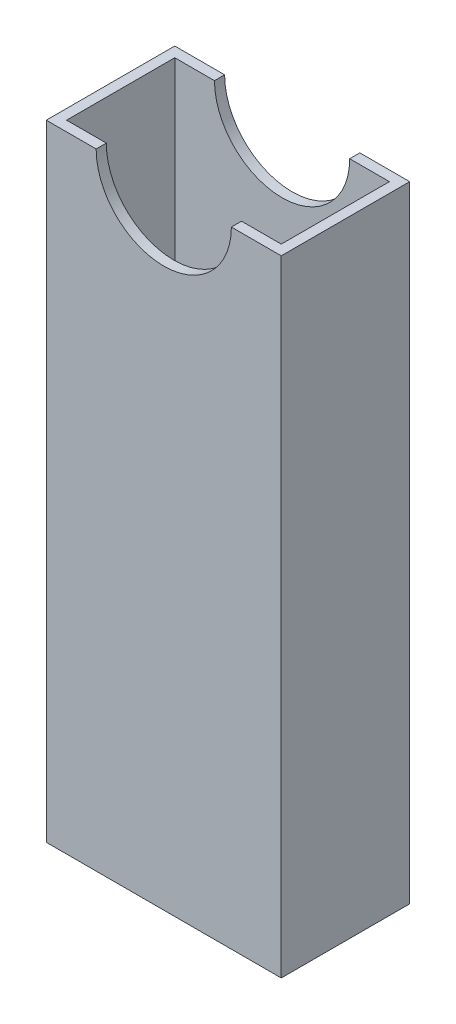
ISO-10303-21;
HEADER;
FILE_DESCRIPTION(('STEP AP214'),'2;1');
FILE_NAME('part.step','',(''),(''),'','','');
FILE_SCHEMA(('AUTOMOTIVE_DESIGN { 1 0 10303 214 1 1 1 1 }'));
ENDSEC;
DATA;
#1=APPLICATION_CONTEXT('core data for automotive mechanical design processes');
#2=APPLICATION_PROTOCOL_DEFINITION('international standard','automotive_design',2000,#1);
#3=PRODUCT_CONTEXT('',#1,'mechanical');
#4=PRODUCT('Part','Part','',(#3));
#5=PRODUCT_RELATED_PRODUCT_CATEGORY('part','',(#4));
#6=PRODUCT_DEFINITION_FORMATION('','',#4);
#7=PRODUCT_DEFINITION_CONTEXT('part definition',#1,'design');
#8=PRODUCT_DEFINITION('design','',#6,#7);
#9=PRODUCT_DEFINITION_SHAPE('','',#8);
#10=(LENGTH_UNIT() NAMED_UNIT(*) SI_UNIT(.MILLI.,.METRE.));
#11=(NAMED_UNIT(*) PLANE_ANGLE_UNIT() SI_UNIT($,.RADIAN.));
#12=(NAMED_UNIT(*) SI_UNIT($,.STERADIAN.) SOLID_ANGLE_UNIT());
#13=UNCERTAINTY_MEASURE_WITH_UNIT(LENGTH_MEASURE(1.E-05),#10,'distance_accuracy_value','');
#14=(GEOMETRIC_REPRESENTATION_CONTEXT(3) GLOBAL_UNCERTAINTY_ASSIGNED_CONTEXT((#13)) GLOBAL_UNIT_ASSIGNED_CONTEXT((#10,
#11,#12)) REPRESENTATION_CONTEXT('',''));
#15=CARTESIAN_POINT('',(0.,0.,0.));
#16=DIRECTION('',(0.,0.,1.));
#17=DIRECTION('',(1.,0.,0.));
#18=AXIS2_PLACEMENT_3D('',#15,#16,#17);
#19=CARTESIAN_POINT('',(0.,92.5,0.));
#20=DIRECTION('',(0.,1.,0.));
#21=DIRECTION('',(0.,0.,1.));
#22=AXIS2_PLACEMENT_3D('',#19,#20,#21);
#23=PLANE('',#22);
#24=DIRECTION('',(0.,0.,1.));
#25=VECTOR('',#24,1.);
#26=CARTESIAN_POINT('',(-10.,92.5,-31.8606797749979));
#27=LINE('',#26,#25);
#28=CARTESIAN_POINT('',(-10.,92.5,-9.5));
#29=VERTEX_POINT('',#28);
#30=CARTESIAN_POINT('',(-10.,92.5,-8.));
#31=VERTEX_POINT('',#30);
#32=EDGE_CURVE('E57',#29,#31,#27,.T.);
#33=ORIENTED_EDGE('',*,*,#32,.F.);
#34=DIRECTION('',(-1.,0.,0.));
#35=VECTOR('',#34,1.);
#36=CARTESIAN_POINT('',(17.375,92.5,-9.5));
#37=LINE('',#36,#35);
#38=CARTESIAN_POINT('',(-17.375,92.5,-9.5));
#39=VERTEX_POINT('',#38);
#40=EDGE_CURVE('E137',#29,#39,#37,.T.);
#41=ORIENTED_EDGE('',*,*,#40,.T.);
#42=DIRECTION('',(0.,0.,1.));
#43=VECTOR('',#42,1.);
#44=CARTESIAN_POINT('',(-17.375,92.5,-9.5));
#45=LINE('',#44,#43);
#46=CARTESIAN_POINT('',(-17.375,92.5,9.5));
#47=VERTEX_POINT('',#46);
#48=EDGE_CURVE('E187',#39,#47,#45,.T.);
#49=ORIENTED_EDGE('',*,*,#48,.T.);
#50=DIRECTION('',(1.,0.,0.));
#51=VECTOR('',#50,1.);
#52=CARTESIAN_POINT('',(-17.375,92.5,9.5));
#53=LINE('',#52,#51);
#54=CARTESIAN_POINT('',(-10.,92.5,9.5));
#55=VERTEX_POINT('',#54);
#56=EDGE_CURVE('E182',#47,#55,#53,.T.);
#57=ORIENTED_EDGE('',*,*,#56,.T.);
#58=CARTESIAN_POINT('',(-10.,92.5,8.));
#59=VERTEX_POINT('',#58);
#60=EDGE_CURVE('E129',#59,#55,#27,.T.);
#61=ORIENTED_EDGE('',*,*,#60,.F.);
#62=DIRECTION('',(1.,0.,0.));
#63=VECTOR('',#62,1.);
#64=CARTESIAN_POINT('',(-15.875,92.5,8.));
#65=LINE('',#64,#63);
#66=CARTESIAN_POINT('',(-15.875,92.5,8.));
#67=VERTEX_POINT('',#66);
#68=EDGE_CURVE('E218',#67,#59,#65,.T.);
#69=ORIENTED_EDGE('',*,*,#68,.F.);
#70=DIRECTION('',(0.,0.,1.));
#71=VECTOR('',#70,1.);
#72=CARTESIAN_POINT('',(-15.875,92.5,-8.));
#73=LINE('',#72,#71);
#74=CARTESIAN_POINT('',(-15.875,92.5,-8.));
#75=VERTEX_POINT('',#74);
#76=EDGE_CURVE('E205',#75,#67,#73,.T.);
#77=ORIENTED_EDGE('',*,*,#76,.F.);
#78=DIRECTION('',(-1.,0.,0.));
#79=VECTOR('',#78,1.);
#80=CARTESIAN_POINT('',(15.875,92.5,-8.));
#81=LINE('',#80,#79);
#82=EDGE_CURVE('E214',#31,#75,#81,.T.);
#83=ORIENTED_EDGE('',*,*,#82,.F.);
#84=EDGE_LOOP('',(#33,#41,#49,#57,#61,#69,#77,#83));
#85=FACE_BOUND('',#84,.T.);
#86=ADVANCED_FACE('F35',(#85),#23,.T.);
#87=CARTESIAN_POINT('',(17.375,1.5,0.));
#88=DIRECTION('',(1.,0.,0.));
#89=DIRECTION('',(0.,0.,-1.));
#90=AXIS2_PLACEMENT_3D('',#87,#88,#89);
#91=PLANE('',#90);
#92=DIRECTION('',(0.,0.,1.));
#93=VECTOR('',#92,1.);
#94=CARTESIAN_POINT('',(17.375,0.,0.));
#95=LINE('',#94,#93);
#96=CARTESIAN_POINT('',(17.375,0.,-9.5));
#97=VERTEX_POINT('',#96);
#98=CARTESIAN_POINT('',(17.375,0.,9.5));
#99=VERTEX_POINT('',#98);
#100=EDGE_CURVE('E144',#97,#99,#95,.T.);
#101=ORIENTED_EDGE('',*,*,#100,.F.);
#102=DIRECTION('',(0.,-1.,0.));
#103=VECTOR('',#102,1.);
#104=CARTESIAN_POINT('',(17.375,1.5,-9.5));
#105=LINE('',#104,#103);
#106=CARTESIAN_POINT('',(17.375,92.5,-9.5));
#107=VERTEX_POINT('',#106);
#108=EDGE_CURVE('E43',#107,#97,#105,.T.);
#109=ORIENTED_EDGE('',*,*,#108,.F.);
#110=DIRECTION('',(0.,0.,-1.));
#111=VECTOR('',#110,1.);
#112=CARTESIAN_POINT('',(17.375,92.5,9.5));
#113=LINE('',#112,#111);
#114=CARTESIAN_POINT('',(17.375,92.5,9.5));
#115=VERTEX_POINT('',#114);
#116=EDGE_CURVE('E143',#115,#107,#113,.T.);
#117=ORIENTED_EDGE('',*,*,#116,.F.);
#118=DIRECTION('',(0.,-1.,0.));
#119=VECTOR('',#118,1.);
#120=CARTESIAN_POINT('',(17.375,1.5,9.5));
#121=LINE('',#120,#119);
#122=EDGE_CURVE('E159',#115,#99,#121,.T.);
#123=ORIENTED_EDGE('',*,*,#122,.T.);
#124=EDGE_LOOP('',(#101,#109,#117,#123));
#125=FACE_BOUND('',#124,.T.);
#126=ADVANCED_FACE('F37',(#125),#91,.T.);
#127=CARTESIAN_POINT('',(0.,1.5,-9.5));
#128=DIRECTION('',(0.,0.,-1.));
#129=DIRECTION('',(-1.,0.,0.));
#130=AXIS2_PLACEMENT_3D('',#127,#128,#129);
#131=PLANE('',#130);
#132=CARTESIAN_POINT('',(0.,92.5,-9.5));
#133=DIRECTION('',(0.,0.,-1.));
#134=DIRECTION('',(-1.,0.,0.));
#135=AXIS2_PLACEMENT_3D('',#132,#133,#134);
#136=CIRCLE('',#135,10.);
#137=CARTESIAN_POINT('',(10.,92.5,-9.5));
#138=VERTEX_POINT('',#137);
#139=EDGE_CURVE('E124',#29,#138,#136,.F.);
#140=ORIENTED_EDGE('',*,*,#139,.T.);
#141=EDGE_CURVE('E135',#107,#138,#37,.T.);
#142=ORIENTED_EDGE('',*,*,#141,.F.);
#143=ORIENTED_EDGE('',*,*,#108,.T.);
#144=DIRECTION('',(1.,0.,0.));
#145=VECTOR('',#144,1.);
#146=CARTESIAN_POINT('',(0.,0.,-9.5));
#147=LINE('',#146,#145);
#148=CARTESIAN_POINT('',(-17.375,0.,-9.5));
#149=VERTEX_POINT('',#148);
#150=EDGE_CURVE('E147',#149,#97,#147,.T.);
#151=ORIENTED_EDGE('',*,*,#150,.F.);
#152=DIRECTION('',(0.,-1.,0.));
#153=VECTOR('',#152,1.);
#154=CARTESIAN_POINT('',(-17.375,1.5,-9.5));
#155=LINE('',#154,#153);
#156=EDGE_CURVE('E164',#39,#149,#155,.T.);
#157=ORIENTED_EDGE('',*,*,#156,.F.);
#158=ORIENTED_EDGE('',*,*,#40,.F.);
#159=EDGE_LOOP('',(#140,#142,#143,#151,#157,#158));
#160=FACE_BOUND('',#159,.T.);
#161=ADVANCED_FACE('F134',(#160),#131,.T.);
#162=CARTESIAN_POINT('',(-17.375,1.5,0.));
#163=DIRECTION('',(1.,0.,0.));
#164=DIRECTION('',(0.,0.,-1.));
#165=AXIS2_PLACEMENT_3D('',#162,#163,#164);
#166=PLANE('',#165);
#167=DIRECTION('',(0.,0.,1.));
#168=VECTOR('',#167,1.);
#169=CARTESIAN_POINT('',(-17.375,0.,0.));
#170=LINE('',#169,#168);
#171=CARTESIAN_POINT('',(-17.375,0.,9.5));
#172=VERTEX_POINT('',#171);
#173=EDGE_CURVE('E154',#149,#172,#170,.T.);
#174=ORIENTED_EDGE('',*,*,#173,.T.);
#175=DIRECTION('',(0.,-1.,0.));
#176=VECTOR('',#175,1.);
#177=CARTESIAN_POINT('',(-17.375,1.5,9.5));
#178=LINE('',#177,#176);
#179=EDGE_CURVE('E161',#47,#172,#178,.T.);
#180=ORIENTED_EDGE('',*,*,#179,.F.);
#181=ORIENTED_EDGE('',*,*,#48,.F.);
#182=ORIENTED_EDGE('',*,*,#156,.T.);
#183=EDGE_LOOP('',(#174,#180,#181,#182));
#184=FACE_BOUND('',#183,.T.);
#185=ADVANCED_FACE('F174',(#184),#166,.F.);
#186=CARTESIAN_POINT('',(0.,1.5,9.5));
#187=DIRECTION('',(0.,0.,-1.));
#188=DIRECTION('',(-1.,0.,0.));
#189=AXIS2_PLACEMENT_3D('',#186,#187,#188);
#190=PLANE('',#189);
#191=CARTESIAN_POINT('',(10.,92.5,9.5));
#192=VERTEX_POINT('',#191);
#193=EDGE_CURVE('E186',#192,#115,#53,.T.);
#194=ORIENTED_EDGE('',*,*,#193,.F.);
#195=CARTESIAN_POINT('',(0.,92.5,9.5));
#196=DIRECTION('',(0.,0.,1.));
#197=DIRECTION('',(1.,0.,0.));
#198=AXIS2_PLACEMENT_3D('',#195,#196,#197);
#199=CIRCLE('',#198,10.);
#200=EDGE_CURVE('E138',#55,#192,#199,.T.);
#201=ORIENTED_EDGE('',*,*,#200,.F.);
#202=ORIENTED_EDGE('',*,*,#56,.F.);
#203=ORIENTED_EDGE('',*,*,#179,.T.);
#204=DIRECTION('',(1.,0.,0.));
#205=VECTOR('',#204,1.);
#206=CARTESIAN_POINT('',(0.,0.,9.5));
#207=LINE('',#206,#205);
#208=EDGE_CURVE('E156',#172,#99,#207,.T.);
#209=ORIENTED_EDGE('',*,*,#208,.T.);
#210=ORIENTED_EDGE('',*,*,#122,.F.);
#211=EDGE_LOOP('',(#194,#201,#202,#203,#209,#210));
#212=FACE_BOUND('',#211,.T.);
#213=ADVANCED_FACE('F179',(#212),#190,.F.);
#214=CARTESIAN_POINT('',(0.,0.,0.));
#215=DIRECTION('',(0.,1.,0.));
#216=DIRECTION('',(0.,0.,1.));
#217=AXIS2_PLACEMENT_3D('',#214,#215,#216);
#218=PLANE('',#217);
#219=ORIENTED_EDGE('',*,*,#100,.T.);
#220=ORIENTED_EDGE('',*,*,#208,.F.);
#221=ORIENTED_EDGE('',*,*,#173,.F.);
#222=ORIENTED_EDGE('',*,*,#150,.T.);
#223=EDGE_LOOP('',(#219,#220,#221,#222));
#224=FACE_BOUND('',#223,.T.);
#225=ADVANCED_FACE('F172',(#224),#218,.F.);
#226=DIRECTION('',(0.,0.,1.));
#227=VECTOR('',#226,1.);
#228=CARTESIAN_POINT('',(10.,92.5,-31.8606797749979));
#229=LINE('',#228,#227);
#230=CARTESIAN_POINT('',(10.,92.5,8.));
#231=VERTEX_POINT('',#230);
#232=EDGE_CURVE('E50',#231,#192,#229,.T.);
#233=ORIENTED_EDGE('',*,*,#232,.T.);
#234=ORIENTED_EDGE('',*,*,#193,.T.);
#235=ORIENTED_EDGE('',*,*,#116,.T.);
#236=ORIENTED_EDGE('',*,*,#141,.T.);
#237=CARTESIAN_POINT('',(10.,92.5,-8.));
#238=VERTEX_POINT('',#237);
#239=EDGE_CURVE('E121',#138,#238,#229,.T.);
#240=ORIENTED_EDGE('',*,*,#239,.T.);
#241=CARTESIAN_POINT('',(15.875,92.5,-8.));
#242=VERTEX_POINT('',#241);
#243=EDGE_CURVE('E202',#242,#238,#81,.T.);
#244=ORIENTED_EDGE('',*,*,#243,.F.);
#245=DIRECTION('',(0.,0.,-1.));
#246=VECTOR('',#245,1.);
#247=CARTESIAN_POINT('',(15.875,92.5,8.));
#248=LINE('',#247,#246);
#249=CARTESIAN_POINT('',(15.875,92.5,8.));
#250=VERTEX_POINT('',#249);
#251=EDGE_CURVE('E215',#250,#242,#248,.T.);
#252=ORIENTED_EDGE('',*,*,#251,.F.);
#253=EDGE_CURVE('E221',#231,#250,#65,.T.);
#254=ORIENTED_EDGE('',*,*,#253,.F.);
#255=EDGE_LOOP('',(#233,#234,#235,#236,#240,#244,#252,#254));
#256=FACE_BOUND('',#255,.T.);
#257=ADVANCED_FACE('F141',(#256),#23,.T.);
#258=CARTESIAN_POINT('',(-15.875,92.5,-8.));
#259=DIRECTION('',(1.,0.,0.));
#260=DIRECTION('',(0.,0.,-1.));
#261=AXIS2_PLACEMENT_3D('',#258,#259,#260);
#262=PLANE('',#261);
#263=DIRECTION('',(0.,0.,1.));
#264=VECTOR('',#263,1.);
#265=CARTESIAN_POINT('',(-15.875,1.5,-8.));
#266=LINE('',#265,#264);
#267=CARTESIAN_POINT('',(-15.875,1.5,-8.));
#268=VERTEX_POINT('',#267);
#269=CARTESIAN_POINT('',(-15.875,1.5,8.));
#270=VERTEX_POINT('',#269);
#271=EDGE_CURVE('E210',#268,#270,#266,.T.);
#272=ORIENTED_EDGE('',*,*,#271,.F.);
#273=DIRECTION('',(0.,-1.,0.));
#274=VECTOR('',#273,1.);
#275=CARTESIAN_POINT('',(-15.875,92.5,-8.));
#276=LINE('',#275,#274);
#277=EDGE_CURVE('E199',#75,#268,#276,.T.);
#278=ORIENTED_EDGE('',*,*,#277,.F.);
#279=ORIENTED_EDGE('',*,*,#76,.T.);
#280=DIRECTION('',(0.,-1.,0.));
#281=VECTOR('',#280,1.);
#282=CARTESIAN_POINT('',(-15.875,92.5,8.));
#283=LINE('',#282,#281);
#284=EDGE_CURVE('E188',#67,#270,#283,.T.);
#285=ORIENTED_EDGE('',*,*,#284,.T.);
#286=EDGE_LOOP('',(#272,#278,#279,#285));
#287=FACE_BOUND('',#286,.T.);
#288=ADVANCED_FACE('F242',(#287),#262,.T.);
#289=CARTESIAN_POINT('',(-15.875,92.5,8.));
#290=DIRECTION('',(0.,0.,-1.));
#291=DIRECTION('',(-1.,0.,0.));
#292=AXIS2_PLACEMENT_3D('',#289,#290,#291);
#293=PLANE('',#292);
#294=CARTESIAN_POINT('',(0.,92.5,8.));
#295=DIRECTION('',(0.,0.,-1.));
#296=DIRECTION('',(-1.,0.,0.));
#297=AXIS2_PLACEMENT_3D('',#294,#295,#296);
#298=CIRCLE('',#297,10.);
#299=EDGE_CURVE('E212',#231,#59,#298,.T.);
#300=ORIENTED_EDGE('',*,*,#299,.F.);
#301=ORIENTED_EDGE('',*,*,#253,.T.);
#302=DIRECTION('',(0.,-1.,0.));
#303=VECTOR('',#302,1.);
#304=CARTESIAN_POINT('',(15.875,92.5,8.));
#305=LINE('',#304,#303);
#306=CARTESIAN_POINT('',(15.875,1.5,8.));
#307=VERTEX_POINT('',#306);
#308=EDGE_CURVE('E191',#250,#307,#305,.T.);
#309=ORIENTED_EDGE('',*,*,#308,.T.);
#310=DIRECTION('',(1.,0.,0.));
#311=VECTOR('',#310,1.);
#312=CARTESIAN_POINT('',(-15.875,1.5,8.));
#313=LINE('',#312,#311);
#314=EDGE_CURVE('E208',#270,#307,#313,.T.);
#315=ORIENTED_EDGE('',*,*,#314,.F.);
#316=ORIENTED_EDGE('',*,*,#284,.F.);
#317=ORIENTED_EDGE('',*,*,#68,.T.);
#318=EDGE_LOOP('',(#300,#301,#309,#315,#316,#317));
#319=FACE_BOUND('',#318,.T.);
#320=ADVANCED_FACE('F230',(#319),#293,.T.);
#321=CARTESIAN_POINT('',(15.875,92.5,8.));
#322=DIRECTION('',(-1.,0.,0.));
#323=DIRECTION('',(0.,0.,1.));
#324=AXIS2_PLACEMENT_3D('',#321,#322,#323);
#325=PLANE('',#324);
#326=DIRECTION('',(0.,0.,-1.));
#327=VECTOR('',#326,1.);
#328=CARTESIAN_POINT('',(15.875,1.5,8.));
#329=LINE('',#328,#327);
#330=CARTESIAN_POINT('',(15.875,1.5,-8.));
#331=VERTEX_POINT('',#330);
#332=EDGE_CURVE('E206',#307,#331,#329,.T.);
#333=ORIENTED_EDGE('',*,*,#332,.F.);
#334=ORIENTED_EDGE('',*,*,#308,.F.);
#335=ORIENTED_EDGE('',*,*,#251,.T.);
#336=DIRECTION('',(0.,-1.,0.));
#337=VECTOR('',#336,1.);
#338=CARTESIAN_POINT('',(15.875,92.5,-8.));
#339=LINE('',#338,#337);
#340=EDGE_CURVE('E196',#242,#331,#339,.T.);
#341=ORIENTED_EDGE('',*,*,#340,.T.);
#342=EDGE_LOOP('',(#333,#334,#335,#341));
#343=FACE_BOUND('',#342,.T.);
#344=ADVANCED_FACE('F234',(#343),#325,.T.);
#345=CARTESIAN_POINT('',(15.875,92.5,-8.));
#346=DIRECTION('',(0.,0.,1.));
#347=DIRECTION('',(1.,0.,0.));
#348=AXIS2_PLACEMENT_3D('',#345,#346,#347);
#349=PLANE('',#348);
#350=CARTESIAN_POINT('',(0.,92.5,-8.));
#351=DIRECTION('',(0.,0.,1.));
#352=DIRECTION('',(1.,0.,0.));
#353=AXIS2_PLACEMENT_3D('',#350,#351,#352);
#354=CIRCLE('',#353,10.);
#355=EDGE_CURVE('E11',#31,#238,#354,.T.);
#356=ORIENTED_EDGE('',*,*,#355,.F.);
#357=ORIENTED_EDGE('',*,*,#82,.T.);
#358=ORIENTED_EDGE('',*,*,#277,.T.);
#359=DIRECTION('',(-1.,0.,0.));
#360=VECTOR('',#359,1.);
#361=CARTESIAN_POINT('',(15.875,1.5,-8.));
#362=LINE('',#361,#360);
#363=EDGE_CURVE('E203',#331,#268,#362,.T.);
#364=ORIENTED_EDGE('',*,*,#363,.F.);
#365=ORIENTED_EDGE('',*,*,#340,.F.);
#366=ORIENTED_EDGE('',*,*,#243,.T.);
#367=EDGE_LOOP('',(#356,#357,#358,#364,#365,#366));
#368=FACE_BOUND('',#367,.T.);
#369=ADVANCED_FACE('F247',(#368),#349,.T.);
#370=CARTESIAN_POINT('',(0.,1.5,0.));
#371=DIRECTION('',(0.,1.,0.));
#372=DIRECTION('',(0.,0.,1.));
#373=AXIS2_PLACEMENT_3D('',#370,#371,#372);
#374=PLANE('',#373);
#375=ORIENTED_EDGE('',*,*,#271,.T.);
#376=ORIENTED_EDGE('',*,*,#314,.T.);
#377=ORIENTED_EDGE('',*,*,#332,.T.);
#378=ORIENTED_EDGE('',*,*,#363,.T.);
#379=EDGE_LOOP('',(#375,#376,#377,#378));
#380=FACE_BOUND('',#379,.T.);
#381=ADVANCED_FACE('F237',(#380),#374,.T.);
#382=CARTESIAN_POINT('',(0.,92.5,-31.8606797749979));
#383=DIRECTION('',(0.,0.,1.));
#384=DIRECTION('',(1.,0.,0.));
#385=AXIS2_PLACEMENT_3D('',#382,#383,#384);
#386=CYLINDRICAL_SURFACE('',#385,10.);
#387=ORIENTED_EDGE('',*,*,#355,.T.);
#388=ORIENTED_EDGE('',*,*,#239,.F.);
#389=ORIENTED_EDGE('',*,*,#139,.F.);
#390=ORIENTED_EDGE('',*,*,#32,.T.);
#391=EDGE_LOOP('',(#387,#388,#389,#390));
#392=FACE_BOUND('',#391,.T.);
#393=ADVANCED_FACE('F123',(#392),#386,.F.);
#394=ORIENTED_EDGE('',*,*,#299,.T.);
#395=ORIENTED_EDGE('',*,*,#60,.T.);
#396=ORIENTED_EDGE('',*,*,#200,.T.);
#397=ORIENTED_EDGE('',*,*,#232,.F.);
#398=EDGE_LOOP('',(#394,#395,#396,#397));
#399=FACE_BOUND('',#398,.T.);
#400=ADVANCED_FACE('F225',(#399),#386,.F.);
#401=CLOSED_SHELL('',(#86,#126,#161,#185,#213,#225,#257,#288,#320,#344,#369,#381,#393,#400));
#402=MANIFOLD_SOLID_BREP('B2',#401);
#403=ADVANCED_BREP_SHAPE_REPRESENTATION('',(#18,#402),#14);
#404=SHAPE_DEFINITION_REPRESENTATION(#9,#403);
ENDSEC;
END-ISO-10303-21;
